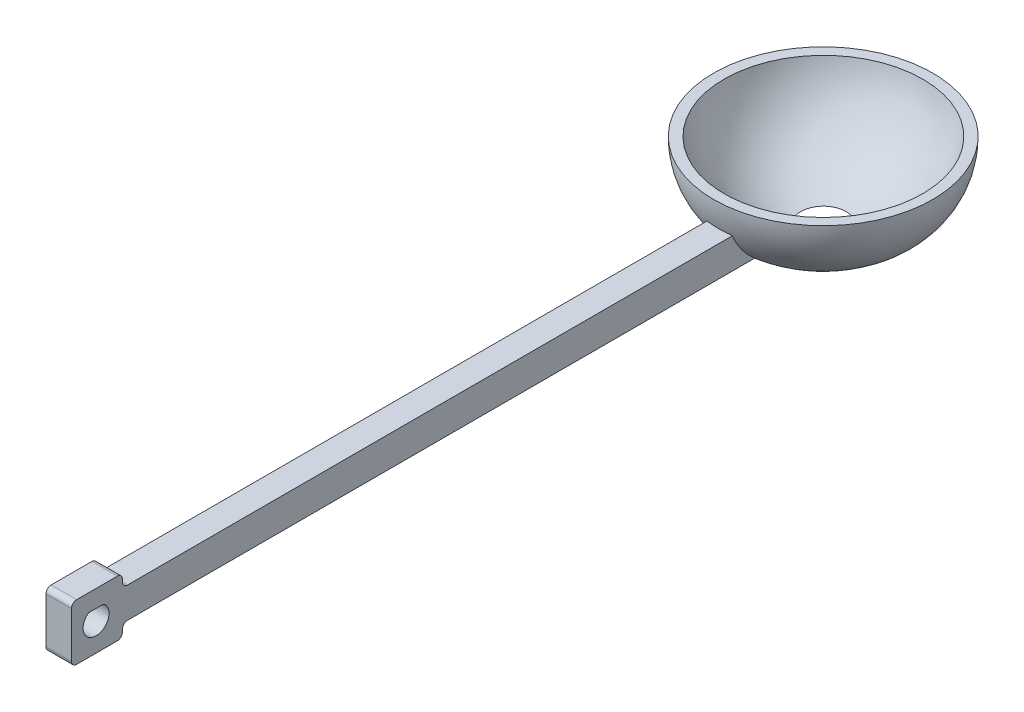
ISO-10303-21;
HEADER;
FILE_DESCRIPTION(('STEP AP214'),'2;1');
FILE_NAME('part.step','',(''),(''),'','','');
FILE_SCHEMA(('AUTOMOTIVE_DESIGN { 1 0 10303 214 1 1 1 1 }'));
ENDSEC;
DATA;
#1=APPLICATION_CONTEXT('core data for automotive mechanical design processes');
#2=APPLICATION_PROTOCOL_DEFINITION('international standard','automotive_design',2000,#1);
#3=PRODUCT_CONTEXT('',#1,'mechanical');
#4=PRODUCT('Part','Part','',(#3));
#5=PRODUCT_RELATED_PRODUCT_CATEGORY('part','',(#4));
#6=PRODUCT_DEFINITION_FORMATION('','',#4);
#7=PRODUCT_DEFINITION_CONTEXT('part definition',#1,'design');
#8=PRODUCT_DEFINITION('design','',#6,#7);
#9=PRODUCT_DEFINITION_SHAPE('','',#8);
#10=(LENGTH_UNIT() NAMED_UNIT(*) SI_UNIT(.MILLI.,.METRE.));
#11=(NAMED_UNIT(*) PLANE_ANGLE_UNIT() SI_UNIT($,.RADIAN.));
#12=(NAMED_UNIT(*) SI_UNIT($,.STERADIAN.) SOLID_ANGLE_UNIT());
#13=UNCERTAINTY_MEASURE_WITH_UNIT(LENGTH_MEASURE(1.E-05),#10,'distance_accuracy_value','');
#14=(GEOMETRIC_REPRESENTATION_CONTEXT(3) GLOBAL_UNCERTAINTY_ASSIGNED_CONTEXT((#13)) GLOBAL_UNIT_ASSIGNED_CONTEXT((#10,
#11,#12)) REPRESENTATION_CONTEXT('',''));
#15=CARTESIAN_POINT('',(0.,0.,0.));
#16=DIRECTION('',(0.,0.,1.));
#17=DIRECTION('',(1.,0.,0.));
#18=AXIS2_PLACEMENT_3D('',#15,#16,#17);
#19=CARTESIAN_POINT('',(-2.5,14.,150.));
#20=DIRECTION('',(0.,1.,0.));
#21=DIRECTION('',(0.,0.,1.));
#22=AXIS2_PLACEMENT_3D('',#19,#20,#21);
#23=PLANE('',#22);
#24=DIRECTION('',(0.,0.,-1.));
#25=VECTOR('',#24,1.);
#26=CARTESIAN_POINT('',(2.5,14.,150.));
#27=LINE('',#26,#25);
#28=CARTESIAN_POINT('',(2.5,14.,139.));
#29=VERTEX_POINT('',#28);
#30=CARTESIAN_POINT('',(2.5,14.,15.9357723957039));
#31=VERTEX_POINT('',#30);
#32=EDGE_CURVE('E188',#29,#31,#27,.T.);
#33=ORIENTED_EDGE('',*,*,#32,.F.);
#34=DIRECTION('',(1.,0.,0.));
#35=VECTOR('',#34,1.);
#36=CARTESIAN_POINT('',(-2.5,14.,139.));
#37=LINE('',#36,#35);
#38=CARTESIAN_POINT('',(-2.5,14.,139.));
#39=VERTEX_POINT('',#38);
#40=EDGE_CURVE('E249',#29,#39,#37,.F.);
#41=ORIENTED_EDGE('',*,*,#40,.T.);
#42=DIRECTION('',(0.,0.,-1.));
#43=VECTOR('',#42,1.);
#44=CARTESIAN_POINT('',(-2.5,14.,150.));
#45=LINE('',#44,#43);
#46=CARTESIAN_POINT('',(-2.5,14.,15.9357723957039));
#47=VERTEX_POINT('',#46);
#48=EDGE_CURVE('E190',#39,#47,#45,.T.);
#49=ORIENTED_EDGE('',*,*,#48,.T.);
#50=CARTESIAN_POINT('',(0.,14.,0.));
#51=DIRECTION('',(0.,1.,0.));
#52=DIRECTION('',(0.,0.,1.));
#53=AXIS2_PLACEMENT_3D('',#50,#51,#52);
#54=CIRCLE('',#53,16.1306801421292);
#55=EDGE_CURVE('E211',#47,#31,#54,.T.);
#56=ORIENTED_EDGE('',*,*,#55,.T.);
#57=EDGE_LOOP('',(#33,#41,#49,#56));
#58=FACE_BOUND('',#57,.T.);
#59=ADVANCED_FACE('F36',(#58),#23,.F.);
#60=CARTESIAN_POINT('',(-2.5,20.,150.));
#61=DIRECTION('',(0.,-1.,0.));
#62=DIRECTION('',(0.,0.,-1.));
#63=AXIS2_PLACEMENT_3D('',#60,#61,#62);
#64=PLANE('',#63);
#65=DIRECTION('',(0.,0.,-1.));
#66=VECTOR('',#65,1.);
#67=CARTESIAN_POINT('',(-2.5,20.,150.));
#68=LINE('',#67,#66);
#69=CARTESIAN_POINT('',(-2.5,20.,139.));
#70=VERTEX_POINT('',#69);
#71=CARTESIAN_POINT('',(-2.5,20.,20.3019386901938));
#72=VERTEX_POINT('',#71);
#73=EDGE_CURVE('E184',#70,#72,#68,.T.);
#74=ORIENTED_EDGE('',*,*,#73,.F.);
#75=DIRECTION('',(-1.,0.,0.));
#76=VECTOR('',#75,1.);
#77=CARTESIAN_POINT('',(2.5,20.,139.));
#78=LINE('',#77,#76);
#79=CARTESIAN_POINT('',(2.5,20.,139.));
#80=VERTEX_POINT('',#79);
#81=EDGE_CURVE('E299',#70,#80,#78,.F.);
#82=ORIENTED_EDGE('',*,*,#81,.T.);
#83=DIRECTION('',(0.,0.,-1.));
#84=VECTOR('',#83,1.);
#85=CARTESIAN_POINT('',(2.5,20.,150.));
#86=LINE('',#85,#84);
#87=CARTESIAN_POINT('',(2.5,20.,20.3019386901938));
#88=VERTEX_POINT('',#87);
#89=EDGE_CURVE('E186',#80,#88,#86,.T.);
#90=ORIENTED_EDGE('',*,*,#89,.T.);
#91=CARTESIAN_POINT('',(0.,20.,0.));
#92=DIRECTION('',(0.,1.,0.));
#93=DIRECTION('',(0.,0.,1.));
#94=AXIS2_PLACEMENT_3D('',#91,#92,#93);
#95=CIRCLE('',#94,20.4552857369529);
#96=EDGE_CURVE('E192',#88,#72,#95,.F.);
#97=ORIENTED_EDGE('',*,*,#96,.T.);
#98=EDGE_LOOP('',(#74,#82,#90,#97));
#99=FACE_BOUND('',#98,.T.);
#100=ADVANCED_FACE('F238',(#99),#64,.F.);
#101=CARTESIAN_POINT('',(-2.5,20.,150.));
#102=DIRECTION('',(1.,0.,0.));
#103=DIRECTION('',(0.,1.,0.));
#104=AXIS2_PLACEMENT_3D('',#101,#102,#103);
#105=PLANE('',#104);
#106=DIRECTION('',(0.,0.,1.));
#107=VECTOR('',#106,1.);
#108=CARTESIAN_POINT('',(-2.5,19.1,150.));
#109=LINE('',#108,#107);
#110=CARTESIAN_POINT('',(-2.5,19.1,143.727735441463));
#111=VERTEX_POINT('',#110);
#112=CARTESIAN_POINT('',(-2.5,19.1,146.620830669761));
#113=VERTEX_POINT('',#112);
#114=EDGE_CURVE('E157',#111,#113,#109,.T.);
#115=ORIENTED_EDGE('',*,*,#114,.T.);
#116=CARTESIAN_POINT('',(-2.5,17.,145.174283055612));
#117=DIRECTION('',(1.,0.,0.));
#118=DIRECTION('',(0.,1.,0.));
#119=AXIS2_PLACEMENT_3D('',#116,#117,#118);
#120=CIRCLE('',#119,2.55000000000001);
#121=EDGE_CURVE('E154',#113,#111,#120,.T.);
#122=ORIENTED_EDGE('',*,*,#121,.T.);
#123=EDGE_LOOP('',(#115,#122));
#124=FACE_BOUND('',#123,.T.);
#125=DIRECTION('',(0.,1.,0.));
#126=VECTOR('',#125,1.);
#127=CARTESIAN_POINT('',(-2.5,11.5,140.));
#128=LINE('',#127,#126);
#129=CARTESIAN_POINT('',(-2.5,12.5,140.));
#130=VERTEX_POINT('',#129);
#131=CARTESIAN_POINT('',(-2.5,13.,140.));
#132=VERTEX_POINT('',#131);
#133=EDGE_CURVE('E304',#130,#132,#128,.T.);
#134=ORIENTED_EDGE('',*,*,#133,.F.);
#135=CARTESIAN_POINT('',(-2.5,12.5,141.));
#136=DIRECTION('',(1.,0.,0.));
#137=DIRECTION('',(0.,1.,0.));
#138=AXIS2_PLACEMENT_3D('',#135,#136,#137);
#139=CIRCLE('',#138,1.);
#140=CARTESIAN_POINT('',(-2.5,11.5,141.));
#141=VERTEX_POINT('',#140);
#142=EDGE_CURVE('E283',#130,#141,#139,.F.);
#143=ORIENTED_EDGE('',*,*,#142,.T.);
#144=DIRECTION('',(0.,0.,-1.));
#145=VECTOR('',#144,1.);
#146=CARTESIAN_POINT('',(-2.5,11.5,150.));
#147=LINE('',#146,#145);
#148=CARTESIAN_POINT('',(-2.5,11.5,149.));
#149=VERTEX_POINT('',#148);
#150=EDGE_CURVE('E354',#149,#141,#147,.T.);
#151=ORIENTED_EDGE('',*,*,#150,.F.);
#152=CARTESIAN_POINT('',(-2.5,12.5,149.));
#153=DIRECTION('',(1.,0.,0.));
#154=DIRECTION('',(0.,1.,0.));
#155=AXIS2_PLACEMENT_3D('',#152,#153,#154);
#156=CIRCLE('',#155,1.);
#157=CARTESIAN_POINT('',(-2.5,12.5,150.));
#158=VERTEX_POINT('',#157);
#159=EDGE_CURVE('E281',#149,#158,#156,.F.);
#160=ORIENTED_EDGE('',*,*,#159,.T.);
#161=DIRECTION('',(0.,-1.,0.));
#162=VECTOR('',#161,1.);
#163=CARTESIAN_POINT('',(-2.5,20.,150.));
#164=LINE('',#163,#162);
#165=CARTESIAN_POINT('',(-2.5,21.5,150.));
#166=VERTEX_POINT('',#165);
#167=EDGE_CURVE('E178',#166,#158,#164,.T.);
#168=ORIENTED_EDGE('',*,*,#167,.F.);
#169=CARTESIAN_POINT('',(-2.5,21.5,149.));
#170=DIRECTION('',(1.,0.,0.));
#171=DIRECTION('',(0.,1.,0.));
#172=AXIS2_PLACEMENT_3D('',#169,#170,#171);
#173=CIRCLE('',#172,1.);
#174=CARTESIAN_POINT('',(-2.5,22.5,149.));
#175=VERTEX_POINT('',#174);
#176=EDGE_CURVE('E279',#166,#175,#173,.F.);
#177=ORIENTED_EDGE('',*,*,#176,.T.);
#178=DIRECTION('',(0.,0.,1.));
#179=VECTOR('',#178,1.);
#180=CARTESIAN_POINT('',(-2.5,22.5,150.));
#181=LINE('',#180,#179);
#182=CARTESIAN_POINT('',(-2.5,22.5,141.));
#183=VERTEX_POINT('',#182);
#184=EDGE_CURVE('E315',#183,#175,#181,.T.);
#185=ORIENTED_EDGE('',*,*,#184,.F.);
#186=CARTESIAN_POINT('',(-2.5,21.5,141.));
#187=DIRECTION('',(1.,0.,0.));
#188=DIRECTION('',(0.,1.,0.));
#189=AXIS2_PLACEMENT_3D('',#186,#187,#188);
#190=CIRCLE('',#189,1.);
#191=CARTESIAN_POINT('',(-2.5,21.5,140.));
#192=VERTEX_POINT('',#191);
#193=EDGE_CURVE('E277',#183,#192,#190,.F.);
#194=ORIENTED_EDGE('',*,*,#193,.T.);
#195=DIRECTION('',(0.,-1.,0.));
#196=VECTOR('',#195,1.);
#197=CARTESIAN_POINT('',(-2.5,22.5,140.));
#198=LINE('',#197,#196);
#199=CARTESIAN_POINT('',(-2.5,21.,140.));
#200=VERTEX_POINT('',#199);
#201=EDGE_CURVE('E170',#192,#200,#198,.T.);
#202=ORIENTED_EDGE('',*,*,#201,.T.);
#203=CARTESIAN_POINT('',(-2.5,21.,139.));
#204=DIRECTION('',(1.,0.,0.));
#205=DIRECTION('',(0.,1.,0.));
#206=AXIS2_PLACEMENT_3D('',#203,#204,#205);
#207=CIRCLE('',#206,1.);
#208=EDGE_CURVE('E44',#200,#70,#207,.T.);
#209=ORIENTED_EDGE('',*,*,#208,.T.);
#210=ORIENTED_EDGE('',*,*,#73,.T.);
#211=CARTESIAN_POINT('',(-2.5,20.,20.3019386901938));
#212=CARTESIAN_POINT('',(-2.5,19.8026641187748,20.2235777965969));
#213=CARTESIAN_POINT('',(-2.5,19.6070269826828,20.1410120123851));
#214=CARTESIAN_POINT('',(-2.5,19.2194543473084,19.9676065605312));
#215=CARTESIAN_POINT('',(-2.5,19.0275188514697,19.8767668851922));
#216=CARTESIAN_POINT('',(-2.5,18.4576865835021,19.5920236068438));
#217=CARTESIAN_POINT('',(-2.5,18.0858005157144,19.3859102448067));
#218=CARTESIAN_POINT('',(-2.5,17.3684855124467,18.9473361657052));
#219=CARTESIAN_POINT('',(-2.5,17.0226691059997,18.7155065084903));
#220=CARTESIAN_POINT('',(-2.5,16.3517130528184,18.2239139270832));
#221=CARTESIAN_POINT('',(-2.5,16.0265641027414,17.964163714925));
#222=CARTESIAN_POINT('',(-2.5,15.4055737695392,17.4241655307821));
#223=CARTESIAN_POINT('',(-2.5,15.1092634071992,17.1444563981804));
#224=CARTESIAN_POINT('',(-2.5,14.537443229401,16.558861521737));
#225=CARTESIAN_POINT('',(-2.5,14.2621791479325,16.2527357930871));
#226=CARTESIAN_POINT('',(-2.5,14.,15.9357723957039));
#227=B_SPLINE_CURVE_WITH_KNOTS('',3,(#211,#212,#213,#214,#215,#216,#217,#218,#219,#220,#221,
#222,#223,#224,#225,#226),.UNSPECIFIED.,.F.,.F.,(4,2,2,2,2,2,2,4),(0.,0.636872603475047,
1.27374579942304,2.54760957834871,3.79520112455621,5.04222703788782,6.26331052404448,
7.49697356599087),.UNSPECIFIED.);
#228=EDGE_CURVE('E199',#72,#47,#227,.T.);
#229=ORIENTED_EDGE('',*,*,#228,.T.);
#230=ORIENTED_EDGE('',*,*,#48,.F.);
#231=CARTESIAN_POINT('',(-2.5,13.,139.));
#232=DIRECTION('',(1.,0.,0.));
#233=DIRECTION('',(0.,1.,0.));
#234=AXIS2_PLACEMENT_3D('',#231,#232,#233);
#235=CIRCLE('',#234,1.);
#236=EDGE_CURVE('E258',#39,#132,#235,.T.);
#237=ORIENTED_EDGE('',*,*,#236,.T.);
#238=EDGE_LOOP('',(#134,#143,#151,#160,#168,#177,#185,#194,#202,#209,#210,#229,#230,#237));
#239=FACE_BOUND('',#238,.T.);
#240=ADVANCED_FACE('F213',(#124,#239),#105,.F.);
#241=CARTESIAN_POINT('',(2.5,20.,150.));
#242=DIRECTION('',(-1.,0.,0.));
#243=DIRECTION('',(0.,-1.,0.));
#244=AXIS2_PLACEMENT_3D('',#241,#242,#243);
#245=PLANE('',#244);
#246=DIRECTION('',(0.,0.,1.));
#247=VECTOR('',#246,1.);
#248=CARTESIAN_POINT('',(2.5,19.1,146.620830669761));
#249=LINE('',#248,#247);
#250=CARTESIAN_POINT('',(2.5,19.1,143.727735441463));
#251=VERTEX_POINT('',#250);
#252=CARTESIAN_POINT('',(2.5,19.1,146.620830669761));
#253=VERTEX_POINT('',#252);
#254=EDGE_CURVE('E161',#251,#253,#249,.T.);
#255=ORIENTED_EDGE('',*,*,#254,.F.);
#256=CARTESIAN_POINT('',(2.5,17.,145.174283055612));
#257=DIRECTION('',(1.,0.,0.));
#258=DIRECTION('',(0.,1.,0.));
#259=AXIS2_PLACEMENT_3D('',#256,#257,#258);
#260=CIRCLE('',#259,2.55000000000001);
#261=EDGE_CURVE('E151',#253,#251,#260,.T.);
#262=ORIENTED_EDGE('',*,*,#261,.F.);
#263=EDGE_LOOP('',(#255,#262));
#264=FACE_BOUND('',#263,.T.);
#265=DIRECTION('',(0.,0.,1.));
#266=VECTOR('',#265,1.);
#267=CARTESIAN_POINT('',(2.5,11.5,150.));
#268=LINE('',#267,#266);
#269=CARTESIAN_POINT('',(2.5,11.5,141.));
#270=VERTEX_POINT('',#269);
#271=CARTESIAN_POINT('',(2.5,11.5,149.));
#272=VERTEX_POINT('',#271);
#273=EDGE_CURVE('E317',#270,#272,#268,.T.);
#274=ORIENTED_EDGE('',*,*,#273,.F.);
#275=CARTESIAN_POINT('',(2.5,12.5,141.));
#276=DIRECTION('',(-1.,0.,0.));
#277=DIRECTION('',(0.,-1.,0.));
#278=AXIS2_PLACEMENT_3D('',#275,#276,#277);
#279=CIRCLE('',#278,1.);
#280=CARTESIAN_POINT('',(2.5,12.5,140.));
#281=VERTEX_POINT('',#280);
#282=EDGE_CURVE('E275',#270,#281,#279,.F.);
#283=ORIENTED_EDGE('',*,*,#282,.T.);
#284=DIRECTION('',(0.,1.,0.));
#285=VECTOR('',#284,1.);
#286=CARTESIAN_POINT('',(2.5,11.5,140.));
#287=LINE('',#286,#285);
#288=CARTESIAN_POINT('',(2.5,13.,140.));
#289=VERTEX_POINT('',#288);
#290=EDGE_CURVE('E312',#281,#289,#287,.T.);
#291=ORIENTED_EDGE('',*,*,#290,.T.);
#292=CARTESIAN_POINT('',(2.5,13.,139.));
#293=DIRECTION('',(-1.,0.,0.));
#294=DIRECTION('',(0.,-1.,0.));
#295=AXIS2_PLACEMENT_3D('',#292,#293,#294);
#296=CIRCLE('',#295,1.);
#297=EDGE_CURVE('E256',#289,#29,#296,.T.);
#298=ORIENTED_EDGE('',*,*,#297,.T.);
#299=ORIENTED_EDGE('',*,*,#32,.T.);
#300=CARTESIAN_POINT('',(2.5,14.,15.9357723957039));
#301=CARTESIAN_POINT('',(2.5,14.2487551833212,16.2364988258959));
#302=CARTESIAN_POINT('',(2.5,14.509288897845,16.5274783403637));
#303=CARTESIAN_POINT('',(2.5,15.0523141491529,17.0883002145506));
#304=CARTESIAN_POINT('',(2.5,15.3348106727266,17.3581377457647));
#305=CARTESIAN_POINT('',(2.5,15.9144741749567,17.8699726439253));
#306=CARTESIAN_POINT('',(2.5,16.2112592549129,18.1124023776503));
#307=CARTESIAN_POINT('',(2.5,16.8224429860803,18.573676428943));
#308=CARTESIAN_POINT('',(2.5,17.1368363133871,18.7925278176047));
#309=CARTESIAN_POINT('',(2.5,17.8581902463823,19.2545179354219));
#310=CARTESIAN_POINT('',(2.5,18.2694037830595,19.4910830599733));
#311=CARTESIAN_POINT('',(2.5,18.904069260293,19.8170238275868));
#312=CARTESIAN_POINT('',(2.5,19.1199595390669,19.9213945329959));
#313=CARTESIAN_POINT('',(2.5,19.5565089233412,20.1196086590471));
#314=CARTESIAN_POINT('',(2.5,19.7771678277719,20.2134525225263));
#315=CARTESIAN_POINT('',(2.5,20.,20.3019386901938));
#316=B_SPLINE_CURVE_WITH_KNOTS('',3,(#300,#301,#302,#303,#304,#305,#306,#307,#308,#309,#310,
#311,#312,#313,#314,#315),.UNSPECIFIED.,.F.,.F.,(4,2,2,2,2,2,2,4),(0.,1.17052762536974,
2.34132180675473,3.48981660177339,4.63796600128811,6.05876141737784,6.77791164232414,
7.49703160312034),.UNSPECIFIED.);
#317=EDGE_CURVE('E225',#31,#88,#316,.T.);
#318=ORIENTED_EDGE('',*,*,#317,.T.);
#319=ORIENTED_EDGE('',*,*,#89,.F.);
#320=CARTESIAN_POINT('',(2.5,21.,139.));
#321=DIRECTION('',(-1.,0.,0.));
#322=DIRECTION('',(0.,-1.,0.));
#323=AXIS2_PLACEMENT_3D('',#320,#321,#322);
#324=CIRCLE('',#323,1.);
#325=CARTESIAN_POINT('',(2.5,21.,140.));
#326=VERTEX_POINT('',#325);
#327=EDGE_CURVE('E11',#80,#326,#324,.T.);
#328=ORIENTED_EDGE('',*,*,#327,.T.);
#329=DIRECTION('',(0.,-1.,0.));
#330=VECTOR('',#329,1.);
#331=CARTESIAN_POINT('',(2.5,22.5,140.));
#332=LINE('',#331,#330);
#333=CARTESIAN_POINT('',(2.5,21.5,140.));
#334=VERTEX_POINT('',#333);
#335=EDGE_CURVE('E167',#334,#326,#332,.T.);
#336=ORIENTED_EDGE('',*,*,#335,.F.);
#337=CARTESIAN_POINT('',(2.5,21.5,141.));
#338=DIRECTION('',(-1.,0.,0.));
#339=DIRECTION('',(0.,-1.,0.));
#340=AXIS2_PLACEMENT_3D('',#337,#338,#339);
#341=CIRCLE('',#340,1.);
#342=CARTESIAN_POINT('',(2.5,22.5,141.));
#343=VERTEX_POINT('',#342);
#344=EDGE_CURVE('E269',#334,#343,#341,.F.);
#345=ORIENTED_EDGE('',*,*,#344,.T.);
#346=DIRECTION('',(0.,0.,-1.));
#347=VECTOR('',#346,1.);
#348=CARTESIAN_POINT('',(2.5,22.5,150.));
#349=LINE('',#348,#347);
#350=CARTESIAN_POINT('',(2.5,22.5,149.));
#351=VERTEX_POINT('',#350);
#352=EDGE_CURVE('E311',#351,#343,#349,.T.);
#353=ORIENTED_EDGE('',*,*,#352,.F.);
#354=CARTESIAN_POINT('',(2.5,21.5,149.));
#355=DIRECTION('',(-1.,0.,0.));
#356=DIRECTION('',(0.,-1.,0.));
#357=AXIS2_PLACEMENT_3D('',#354,#355,#356);
#358=CIRCLE('',#357,1.);
#359=CARTESIAN_POINT('',(2.5,21.5,150.));
#360=VERTEX_POINT('',#359);
#361=EDGE_CURVE('E271',#351,#360,#358,.F.);
#362=ORIENTED_EDGE('',*,*,#361,.T.);
#363=DIRECTION('',(0.,1.,0.));
#364=VECTOR('',#363,1.);
#365=CARTESIAN_POINT('',(2.5,20.,150.));
#366=LINE('',#365,#364);
#367=CARTESIAN_POINT('',(2.5,12.5,150.));
#368=VERTEX_POINT('',#367);
#369=EDGE_CURVE('E181',#368,#360,#366,.T.);
#370=ORIENTED_EDGE('',*,*,#369,.F.);
#371=CARTESIAN_POINT('',(2.5,12.5,149.));
#372=DIRECTION('',(-1.,0.,0.));
#373=DIRECTION('',(0.,-1.,0.));
#374=AXIS2_PLACEMENT_3D('',#371,#372,#373);
#375=CIRCLE('',#374,1.);
#376=EDGE_CURVE('E273',#368,#272,#375,.F.);
#377=ORIENTED_EDGE('',*,*,#376,.T.);
#378=EDGE_LOOP('',(#274,#283,#291,#298,#299,#318,#319,#328,#336,#345,#353,#362,#370,#377));
#379=FACE_BOUND('',#378,.T.);
#380=ADVANCED_FACE('F165',(#264,#379),#245,.F.);
#381=CARTESIAN_POINT('',(0.,0.,150.));
#382=DIRECTION('',(0.,0.,1.));
#383=DIRECTION('',(1.,0.,0.));
#384=AXIS2_PLACEMENT_3D('',#381,#382,#383);
#385=PLANE('',#384);
#386=ORIENTED_EDGE('',*,*,#167,.T.);
#387=DIRECTION('',(-1.,0.,0.));
#388=VECTOR('',#387,1.);
#389=CARTESIAN_POINT('',(0.,12.5,150.));
#390=LINE('',#389,#388);
#391=EDGE_CURVE('E287',#158,#368,#390,.F.);
#392=ORIENTED_EDGE('',*,*,#391,.T.);
#393=ORIENTED_EDGE('',*,*,#369,.T.);
#394=DIRECTION('',(1.,0.,0.));
#395=VECTOR('',#394,1.);
#396=CARTESIAN_POINT('',(0.,21.5,150.));
#397=LINE('',#396,#395);
#398=EDGE_CURVE('E285',#360,#166,#397,.F.);
#399=ORIENTED_EDGE('',*,*,#398,.T.);
#400=EDGE_LOOP('',(#386,#392,#393,#399));
#401=FACE_BOUND('',#400,.T.);
#402=ADVANCED_FACE('F237',(#401),#385,.T.);
#403=CARTESIAN_POINT('',(0.0446536561753419,30.,0.));
#404=DIRECTION('',(-1.,0.,0.));
#405=DIRECTION('',(0.,0.,-1.));
#406=AXIS2_PLACEMENT_3D('',#403,#404,#405);
#407=SPHERICAL_SURFACE('',#406,20.);
#408=CARTESIAN_POINT('',(0.0446536561753419,30.,0.));
#409=DIRECTION('',(0.,-1.,0.));
#410=DIRECTION('',(0.,0.,-1.));
#411=AXIS2_PLACEMENT_3D('',#408,#409,#410);
#412=SPHERICAL_SURFACE('',#411,20.);
#413=CARTESIAN_POINT('',(0.0446536561753419,25.5,0.));
#414=DIRECTION('',(0.,-1.,0.));
#415=DIRECTION('',(0.,0.,-1.));
#416=AXIS2_PLACEMENT_3D('',#413,#414,#415);
#417=CIRCLE('',#416,19.4871752699051);
#418=CARTESIAN_POINT('',(0.0446536561753419,25.5,-19.4871752699051));
#419=VERTEX_POINT('',#418);
#420=EDGE_CURVE('E355',#419,#419,#417,.F.);
#421=ORIENTED_EDGE('',*,*,#420,.T.);
#422=EDGE_LOOP('',(#421));
#423=FACE_BOUND('',#422,.T.);
#424=CARTESIAN_POINT('',(0.0446536561753419,10.5,0.));
#425=DIRECTION('',(0.,1.,0.));
#426=DIRECTION('',(0.,0.,1.));
#427=AXIS2_PLACEMENT_3D('',#424,#425,#426);
#428=CIRCLE('',#427,4.44409720865778);
#429=CARTESIAN_POINT('',(0.0446536561753419,10.5,4.44409720865778));
#430=VERTEX_POINT('',#429);
#431=EDGE_CURVE('E177',#430,#430,#428,.F.);
#432=ORIENTED_EDGE('',*,*,#431,.T.);
#433=EDGE_LOOP('',(#432));
#434=FACE_BOUND('',#433,.T.);
#435=ADVANCED_FACE('F361',(#423,#434),#412,.F.);
#436=CARTESIAN_POINT('',(-21.5,10.5,-21.7835245741548));
#437=DIRECTION('',(0.,1.,0.));
#438=DIRECTION('',(0.,0.,1.));
#439=AXIS2_PLACEMENT_3D('',#436,#437,#438);
#440=PLANE('',#439);
#441=CARTESIAN_POINT('',(0.,10.5,0.));
#442=DIRECTION('',(0.,1.,0.));
#443=DIRECTION('',(0.,0.,1.));
#444=AXIS2_PLACEMENT_3D('',#441,#442,#443);
#445=CIRCLE('',#444,6.5);
#446=CARTESIAN_POINT('',(0.,10.5,6.5));
#447=VERTEX_POINT('',#446);
#448=EDGE_CURVE('E198',#447,#447,#445,.F.);
#449=ORIENTED_EDGE('',*,*,#448,.T.);
#450=EDGE_LOOP('',(#449));
#451=FACE_BOUND('',#450,.T.);
#452=ORIENTED_EDGE('',*,*,#431,.F.);
#453=EDGE_LOOP('',(#452));
#454=FACE_BOUND('',#453,.T.);
#455=ADVANCED_FACE('F384',(#451,#454),#440,.F.);
#456=CARTESIAN_POINT('',(-147.5,17.,145.174283055612));
#457=DIRECTION('',(1.,0.,0.));
#458=DIRECTION('',(0.,1.,0.));
#459=AXIS2_PLACEMENT_3D('',#456,#457,#458);
#460=CYLINDRICAL_SURFACE('',#459,2.55000000000001);
#461=DIRECTION('',(1.,0.,0.));
#462=VECTOR('',#461,1.);
#463=CARTESIAN_POINT('',(-147.5,19.1,146.620830669761));
#464=LINE('',#463,#462);
#465=EDGE_CURVE('E146',#113,#253,#464,.T.);
#466=ORIENTED_EDGE('',*,*,#465,.T.);
#467=ORIENTED_EDGE('',*,*,#261,.T.);
#468=DIRECTION('',(1.,0.,0.));
#469=VECTOR('',#468,1.);
#470=CARTESIAN_POINT('',(-147.5,19.1,143.727735441463));
#471=LINE('',#470,#469);
#472=EDGE_CURVE('E158',#111,#251,#471,.T.);
#473=ORIENTED_EDGE('',*,*,#472,.F.);
#474=ORIENTED_EDGE('',*,*,#121,.F.);
#475=EDGE_LOOP('',(#466,#467,#473,#474));
#476=FACE_BOUND('',#475,.T.);
#477=ADVANCED_FACE('F148',(#476),#460,.F.);
#478=CARTESIAN_POINT('',(-147.5,19.1,146.620830669761));
#479=DIRECTION('',(0.,1.,0.));
#480=DIRECTION('',(-1.,0.,0.));
#481=AXIS2_PLACEMENT_3D('',#478,#479,#480);
#482=PLANE('',#481);
#483=ORIENTED_EDGE('',*,*,#472,.T.);
#484=ORIENTED_EDGE('',*,*,#254,.T.);
#485=ORIENTED_EDGE('',*,*,#465,.F.);
#486=ORIENTED_EDGE('',*,*,#114,.F.);
#487=EDGE_LOOP('',(#483,#484,#485,#486));
#488=FACE_BOUND('',#487,.T.);
#489=ADVANCED_FACE('F162',(#488),#482,.F.);
#490=CARTESIAN_POINT('',(0.,25.5,0.));
#491=DIRECTION('',(0.,1.,0.));
#492=DIRECTION('',(0.,0.,1.));
#493=AXIS2_PLACEMENT_3D('',#490,#491,#492);
#494=DEGENERATE_TOROIDAL_SURFACE('',#493,6.5,15.,.T.);
#495=ORIENTED_EDGE('',*,*,#448,.F.);
#496=EDGE_LOOP('',(#495));
#497=FACE_BOUND('',#496,.T.);
#498=CARTESIAN_POINT('',(0.,25.5,0.));
#499=DIRECTION('',(0.,1.,0.));
#500=DIRECTION('',(0.,0.,1.));
#501=AXIS2_PLACEMENT_3D('',#498,#499,#500);
#502=CIRCLE('',#501,21.5);
#503=CARTESIAN_POINT('',(0.,25.5,21.5));
#504=VERTEX_POINT('',#503);
#505=EDGE_CURVE('E195',#504,#504,#502,.T.);
#506=ORIENTED_EDGE('',*,*,#505,.F.);
#507=EDGE_LOOP('',(#506));
#508=FACE_BOUND('',#507,.T.);
#509=ORIENTED_EDGE('',*,*,#228,.F.);
#510=ORIENTED_EDGE('',*,*,#96,.F.);
#511=ORIENTED_EDGE('',*,*,#317,.F.);
#512=ORIENTED_EDGE('',*,*,#55,.F.);
#513=EDGE_LOOP('',(#509,#510,#511,#512));
#514=FACE_BOUND('',#513,.T.);
#515=ADVANCED_FACE('F216',(#497,#508,#514),#494,.T.);
#516=CARTESIAN_POINT('',(2.5,22.5,140.));
#517=DIRECTION('',(0.,0.,1.));
#518=DIRECTION('',(1.,0.,0.));
#519=AXIS2_PLACEMENT_3D('',#516,#517,#518);
#520=PLANE('',#519);
#521=ORIENTED_EDGE('',*,*,#201,.F.);
#522=DIRECTION('',(-1.,0.,0.));
#523=VECTOR('',#522,1.);
#524=CARTESIAN_POINT('',(2.5,21.5,140.));
#525=LINE('',#524,#523);
#526=EDGE_CURVE('E297',#192,#334,#525,.F.);
#527=ORIENTED_EDGE('',*,*,#526,.T.);
#528=ORIENTED_EDGE('',*,*,#335,.T.);
#529=DIRECTION('',(-1.,0.,0.));
#530=VECTOR('',#529,1.);
#531=CARTESIAN_POINT('',(-2.5,21.,140.));
#532=LINE('',#531,#530);
#533=EDGE_CURVE('E295',#326,#200,#532,.T.);
#534=ORIENTED_EDGE('',*,*,#533,.T.);
#535=EDGE_LOOP('',(#521,#527,#528,#534));
#536=FACE_BOUND('',#535,.T.);
#537=ADVANCED_FACE('F220',(#536),#520,.F.);
#538=CARTESIAN_POINT('',(0.,22.5,0.));
#539=DIRECTION('',(0.,1.,0.));
#540=DIRECTION('',(0.,0.,1.));
#541=AXIS2_PLACEMENT_3D('',#538,#539,#540);
#542=PLANE('',#541);
#543=ORIENTED_EDGE('',*,*,#184,.T.);
#544=DIRECTION('',(1.,0.,0.));
#545=VECTOR('',#544,1.);
#546=CARTESIAN_POINT('',(0.,22.5,149.));
#547=LINE('',#546,#545);
#548=EDGE_CURVE('E292',#175,#351,#547,.T.);
#549=ORIENTED_EDGE('',*,*,#548,.T.);
#550=ORIENTED_EDGE('',*,*,#352,.T.);
#551=DIRECTION('',(-1.,0.,0.));
#552=VECTOR('',#551,1.);
#553=CARTESIAN_POINT('',(-2.5,22.5,141.));
#554=LINE('',#553,#552);
#555=EDGE_CURVE('E289',#343,#183,#554,.T.);
#556=ORIENTED_EDGE('',*,*,#555,.T.);
#557=EDGE_LOOP('',(#543,#549,#550,#556));
#558=FACE_BOUND('',#557,.T.);
#559=ADVANCED_FACE('F334',(#558),#542,.T.);
#560=CARTESIAN_POINT('',(-2.5,11.5,140.));
#561=DIRECTION('',(0.,0.,1.));
#562=DIRECTION('',(1.,0.,0.));
#563=AXIS2_PLACEMENT_3D('',#560,#561,#562);
#564=PLANE('',#563);
#565=ORIENTED_EDGE('',*,*,#133,.T.);
#566=DIRECTION('',(1.,0.,0.));
#567=VECTOR('',#566,1.);
#568=CARTESIAN_POINT('',(2.5,13.,140.));
#569=LINE('',#568,#567);
#570=EDGE_CURVE('E260',#132,#289,#569,.T.);
#571=ORIENTED_EDGE('',*,*,#570,.T.);
#572=ORIENTED_EDGE('',*,*,#290,.F.);
#573=DIRECTION('',(1.,0.,0.));
#574=VECTOR('',#573,1.);
#575=CARTESIAN_POINT('',(-2.5,12.5,140.));
#576=LINE('',#575,#574);
#577=EDGE_CURVE('E202',#281,#130,#576,.F.);
#578=ORIENTED_EDGE('',*,*,#577,.T.);
#579=EDGE_LOOP('',(#565,#571,#572,#578));
#580=FACE_BOUND('',#579,.T.);
#581=ADVANCED_FACE('F307',(#580),#564,.F.);
#582=CARTESIAN_POINT('',(0.,11.5,0.));
#583=DIRECTION('',(0.,-1.,0.));
#584=DIRECTION('',(0.,0.,-1.));
#585=AXIS2_PLACEMENT_3D('',#582,#583,#584);
#586=PLANE('',#585);
#587=ORIENTED_EDGE('',*,*,#150,.T.);
#588=DIRECTION('',(1.,0.,0.));
#589=VECTOR('',#588,1.);
#590=CARTESIAN_POINT('',(2.5,11.5,141.));
#591=LINE('',#590,#589);
#592=EDGE_CURVE('E263',#141,#270,#591,.T.);
#593=ORIENTED_EDGE('',*,*,#592,.T.);
#594=ORIENTED_EDGE('',*,*,#273,.T.);
#595=DIRECTION('',(-1.,0.,0.));
#596=VECTOR('',#595,1.);
#597=CARTESIAN_POINT('',(0.,11.5,149.));
#598=LINE('',#597,#596);
#599=EDGE_CURVE('E259',#272,#149,#598,.T.);
#600=ORIENTED_EDGE('',*,*,#599,.T.);
#601=EDGE_LOOP('',(#587,#593,#594,#600));
#602=FACE_BOUND('',#601,.T.);
#603=ADVANCED_FACE('F351',(#602),#586,.T.);
#604=CARTESIAN_POINT('',(-2.5,13.,139.));
#605=DIRECTION('',(-1.,0.,0.));
#606=DIRECTION('',(0.,0.,1.));
#607=AXIS2_PLACEMENT_3D('',#604,#605,#606);
#608=CYLINDRICAL_SURFACE('',#607,1.);
#609=ORIENTED_EDGE('',*,*,#236,.F.);
#610=ORIENTED_EDGE('',*,*,#40,.F.);
#611=ORIENTED_EDGE('',*,*,#297,.F.);
#612=ORIENTED_EDGE('',*,*,#570,.F.);
#613=EDGE_LOOP('',(#609,#610,#611,#612));
#614=FACE_BOUND('',#613,.T.);
#615=ADVANCED_FACE('F222',(#614),#608,.F.);
#616=CARTESIAN_POINT('',(0.,12.5,141.));
#617=DIRECTION('',(-1.,0.,0.));
#618=DIRECTION('',(0.,0.,1.));
#619=AXIS2_PLACEMENT_3D('',#616,#617,#618);
#620=CYLINDRICAL_SURFACE('',#619,1.);
#621=ORIENTED_EDGE('',*,*,#142,.F.);
#622=ORIENTED_EDGE('',*,*,#577,.F.);
#623=ORIENTED_EDGE('',*,*,#282,.F.);
#624=ORIENTED_EDGE('',*,*,#592,.F.);
#625=EDGE_LOOP('',(#621,#622,#623,#624));
#626=FACE_BOUND('',#625,.T.);
#627=ADVANCED_FACE('F438',(#626),#620,.T.);
#628=CARTESIAN_POINT('',(0.,12.5,149.));
#629=DIRECTION('',(-1.,0.,0.));
#630=DIRECTION('',(0.,0.,1.));
#631=AXIS2_PLACEMENT_3D('',#628,#629,#630);
#632=CYLINDRICAL_SURFACE('',#631,1.);
#633=ORIENTED_EDGE('',*,*,#376,.F.);
#634=ORIENTED_EDGE('',*,*,#391,.F.);
#635=ORIENTED_EDGE('',*,*,#159,.F.);
#636=ORIENTED_EDGE('',*,*,#599,.F.);
#637=EDGE_LOOP('',(#633,#634,#635,#636));
#638=FACE_BOUND('',#637,.T.);
#639=ADVANCED_FACE('F346',(#638),#632,.T.);
#640=CARTESIAN_POINT('',(0.,21.5,149.));
#641=DIRECTION('',(1.,0.,0.));
#642=DIRECTION('',(0.,0.,-1.));
#643=AXIS2_PLACEMENT_3D('',#640,#641,#642);
#644=CYLINDRICAL_SURFACE('',#643,1.);
#645=ORIENTED_EDGE('',*,*,#176,.F.);
#646=ORIENTED_EDGE('',*,*,#398,.F.);
#647=ORIENTED_EDGE('',*,*,#361,.F.);
#648=ORIENTED_EDGE('',*,*,#548,.F.);
#649=EDGE_LOOP('',(#645,#646,#647,#648));
#650=FACE_BOUND('',#649,.T.);
#651=ADVANCED_FACE('F338',(#650),#644,.T.);
#652=CARTESIAN_POINT('',(0.,21.5,141.));
#653=DIRECTION('',(1.,0.,0.));
#654=DIRECTION('',(0.,0.,-1.));
#655=AXIS2_PLACEMENT_3D('',#652,#653,#654);
#656=CYLINDRICAL_SURFACE('',#655,1.);
#657=ORIENTED_EDGE('',*,*,#344,.F.);
#658=ORIENTED_EDGE('',*,*,#526,.F.);
#659=ORIENTED_EDGE('',*,*,#193,.F.);
#660=ORIENTED_EDGE('',*,*,#555,.F.);
#661=EDGE_LOOP('',(#657,#658,#659,#660));
#662=FACE_BOUND('',#661,.T.);
#663=ADVANCED_FACE('F329',(#662),#656,.T.);
#664=CARTESIAN_POINT('',(2.5,21.,139.));
#665=DIRECTION('',(1.,0.,0.));
#666=DIRECTION('',(0.,0.,-1.));
#667=AXIS2_PLACEMENT_3D('',#664,#665,#666);
#668=CYLINDRICAL_SURFACE('',#667,1.);
#669=ORIENTED_EDGE('',*,*,#327,.F.);
#670=ORIENTED_EDGE('',*,*,#81,.F.);
#671=ORIENTED_EDGE('',*,*,#208,.F.);
#672=ORIENTED_EDGE('',*,*,#533,.F.);
#673=EDGE_LOOP('',(#669,#670,#671,#672));
#674=FACE_BOUND('',#673,.T.);
#675=ADVANCED_FACE('F38',(#674),#668,.F.);
#676=CARTESIAN_POINT('',(-21.5,25.5,39.3832233569924));
#677=DIRECTION('',(0.,-1.,0.));
#678=DIRECTION('',(0.,0.,-1.));
#679=AXIS2_PLACEMENT_3D('',#676,#677,#678);
#680=PLANE('',#679);
#681=ORIENTED_EDGE('',*,*,#505,.T.);
#682=EDGE_LOOP('',(#681));
#683=FACE_BOUND('',#682,.T.);
#684=ORIENTED_EDGE('',*,*,#420,.F.);
#685=EDGE_LOOP('',(#684));
#686=FACE_BOUND('',#685,.T.);
#687=ADVANCED_FACE('F364',(#683,#686),#680,.F.);
#688=CLOSED_SHELL('',(#59,#100,#240,#380,#402,#435,#455,#477,#489,#515,#537,#559,#581,#603,#615,
#627,#639,#651,#663,#675,#687));
#689=MANIFOLD_SOLID_BREP('B2',#688);
#690=ADVANCED_BREP_SHAPE_REPRESENTATION('',(#18,#689),#14);
#691=SHAPE_DEFINITION_REPRESENTATION(#9,#690);
ENDSEC;
END-ISO-10303-21;
